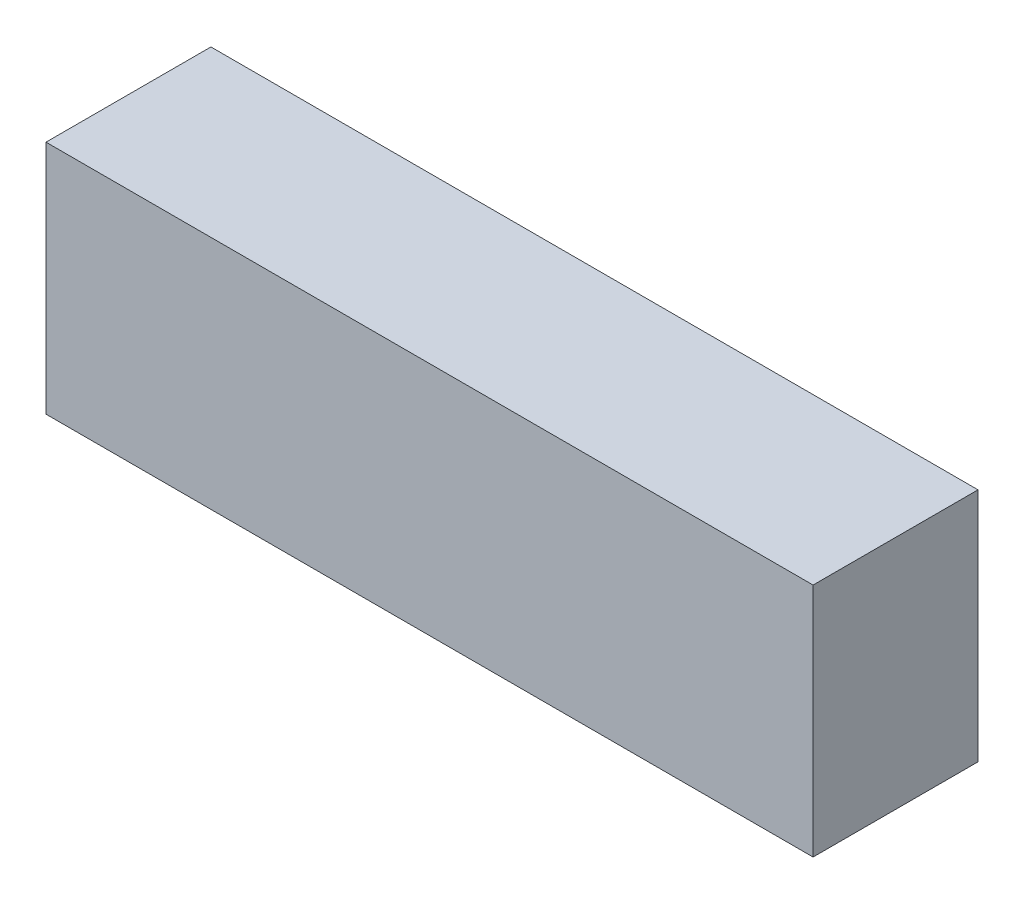
ISO-10303-21;
HEADER;
FILE_DESCRIPTION(('STEP AP214'),'2;1');
FILE_NAME('part.step','',(''),(''),'','','');
FILE_SCHEMA(('AUTOMOTIVE_DESIGN { 1 0 10303 214 1 1 1 1 }'));
ENDSEC;
DATA;
#1=APPLICATION_CONTEXT('core data for automotive mechanical design processes');
#2=APPLICATION_PROTOCOL_DEFINITION('international standard','automotive_design',2000,#1);
#3=PRODUCT_CONTEXT('',#1,'mechanical');
#4=PRODUCT('Part','Part','',(#3));
#5=PRODUCT_RELATED_PRODUCT_CATEGORY('part','',(#4));
#6=PRODUCT_DEFINITION_FORMATION('','',#4);
#7=PRODUCT_DEFINITION_CONTEXT('part definition',#1,'design');
#8=PRODUCT_DEFINITION('design','',#6,#7);
#9=PRODUCT_DEFINITION_SHAPE('','',#8);
#10=(LENGTH_UNIT() NAMED_UNIT(*) SI_UNIT(.MILLI.,.METRE.));
#11=(NAMED_UNIT(*) PLANE_ANGLE_UNIT() SI_UNIT($,.RADIAN.));
#12=(NAMED_UNIT(*) SI_UNIT($,.STERADIAN.) SOLID_ANGLE_UNIT());
#13=UNCERTAINTY_MEASURE_WITH_UNIT(LENGTH_MEASURE(1.E-05),#10,'distance_accuracy_value','');
#14=(GEOMETRIC_REPRESENTATION_CONTEXT(3) GLOBAL_UNCERTAINTY_ASSIGNED_CONTEXT((#13)) GLOBAL_UNIT_ASSIGNED_CONTEXT((#10,
#11,#12)) REPRESENTATION_CONTEXT('',''));
#15=CARTESIAN_POINT('',(0.,0.,0.));
#16=DIRECTION('',(0.,0.,1.));
#17=DIRECTION('',(1.,0.,0.));
#18=AXIS2_PLACEMENT_3D('',#15,#16,#17);
#19=CARTESIAN_POINT('',(16.2798731277834,5.,7.));
#20=DIRECTION('',(-1.,0.,0.));
#21=DIRECTION('',(0.,-1.,0.));
#22=AXIS2_PLACEMENT_3D('',#19,#20,#21);
#23=PLANE('',#22);
#24=DIRECTION('',(0.,1.,0.));
#25=VECTOR('',#24,1.);
#26=CARTESIAN_POINT('',(16.2798731277834,5.,0.));
#27=LINE('',#26,#25);
#28=CARTESIAN_POINT('',(16.2798731277834,-5.,0.));
#29=VERTEX_POINT('',#28);
#30=CARTESIAN_POINT('',(16.2798731277834,5.,0.));
#31=VERTEX_POINT('',#30);
#32=EDGE_CURVE('E94',#29,#31,#27,.T.);
#33=ORIENTED_EDGE('',*,*,#32,.T.);
#34=DIRECTION('',(0.,0.,-1.));
#35=VECTOR('',#34,1.);
#36=CARTESIAN_POINT('',(16.2798731277834,5.,7.));
#37=LINE('',#36,#35);
#38=CARTESIAN_POINT('',(16.2798731277834,5.,7.));
#39=VERTEX_POINT('',#38);
#40=EDGE_CURVE('E11',#39,#31,#37,.T.);
#41=ORIENTED_EDGE('',*,*,#40,.F.);
#42=DIRECTION('',(0.,1.,0.));
#43=VECTOR('',#42,1.);
#44=CARTESIAN_POINT('',(16.2798731277834,5.,7.));
#45=LINE('',#44,#43);
#46=CARTESIAN_POINT('',(16.2798731277834,-5.,7.));
#47=VERTEX_POINT('',#46);
#48=EDGE_CURVE('E82',#47,#39,#45,.T.);
#49=ORIENTED_EDGE('',*,*,#48,.F.);
#50=DIRECTION('',(0.,0.,-1.));
#51=VECTOR('',#50,1.);
#52=CARTESIAN_POINT('',(16.2798731277834,-5.,7.));
#53=LINE('',#52,#51);
#54=EDGE_CURVE('E90',#47,#29,#53,.T.);
#55=ORIENTED_EDGE('',*,*,#54,.T.);
#56=EDGE_LOOP('',(#33,#41,#49,#55));
#57=FACE_BOUND('',#56,.T.);
#58=ADVANCED_FACE('F31',(#57),#23,.F.);
#59=CARTESIAN_POINT('',(-16.2798731277834,5.,7.));
#60=DIRECTION('',(0.,-1.,0.));
#61=DIRECTION('',(0.,0.,-1.));
#62=AXIS2_PLACEMENT_3D('',#59,#60,#61);
#63=PLANE('',#62);
#64=DIRECTION('',(-1.,0.,0.));
#65=VECTOR('',#64,1.);
#66=CARTESIAN_POINT('',(-16.2798731277834,5.,0.));
#67=LINE('',#66,#65);
#68=CARTESIAN_POINT('',(-16.2798731277834,5.,0.));
#69=VERTEX_POINT('',#68);
#70=EDGE_CURVE('E86',#31,#69,#67,.T.);
#71=ORIENTED_EDGE('',*,*,#70,.T.);
#72=DIRECTION('',(0.,0.,-1.));
#73=VECTOR('',#72,1.);
#74=CARTESIAN_POINT('',(-16.2798731277834,5.,7.));
#75=LINE('',#74,#73);
#76=CARTESIAN_POINT('',(-16.2798731277834,5.,7.));
#77=VERTEX_POINT('',#76);
#78=EDGE_CURVE('E39',#77,#69,#75,.T.);
#79=ORIENTED_EDGE('',*,*,#78,.F.);
#80=DIRECTION('',(-1.,0.,0.));
#81=VECTOR('',#80,1.);
#82=CARTESIAN_POINT('',(-16.2798731277834,5.,7.));
#83=LINE('',#82,#81);
#84=EDGE_CURVE('E77',#39,#77,#83,.T.);
#85=ORIENTED_EDGE('',*,*,#84,.F.);
#86=ORIENTED_EDGE('',*,*,#40,.T.);
#87=EDGE_LOOP('',(#71,#79,#85,#86));
#88=FACE_BOUND('',#87,.T.);
#89=ADVANCED_FACE('F85',(#88),#63,.F.);
#90=CARTESIAN_POINT('',(-16.2798731277834,5.,7.));
#91=DIRECTION('',(1.,0.,0.));
#92=DIRECTION('',(0.,0.,-1.));
#93=AXIS2_PLACEMENT_3D('',#90,#91,#92);
#94=PLANE('',#93);
#95=DIRECTION('',(0.,-1.,0.));
#96=VECTOR('',#95,1.);
#97=CARTESIAN_POINT('',(-16.2798731277834,5.,0.));
#98=LINE('',#97,#96);
#99=CARTESIAN_POINT('',(-16.2798731277834,-5.,0.));
#100=VERTEX_POINT('',#99);
#101=EDGE_CURVE('E64',#69,#100,#98,.T.);
#102=ORIENTED_EDGE('',*,*,#101,.T.);
#103=DIRECTION('',(0.,0.,-1.));
#104=VECTOR('',#103,1.);
#105=CARTESIAN_POINT('',(-16.2798731277834,-5.,7.));
#106=LINE('',#105,#104);
#107=CARTESIAN_POINT('',(-16.2798731277834,-5.,7.));
#108=VERTEX_POINT('',#107);
#109=EDGE_CURVE('E87',#108,#100,#106,.T.);
#110=ORIENTED_EDGE('',*,*,#109,.F.);
#111=DIRECTION('',(0.,-1.,0.));
#112=VECTOR('',#111,1.);
#113=CARTESIAN_POINT('',(-16.2798731277834,5.,7.));
#114=LINE('',#113,#112);
#115=EDGE_CURVE('E80',#77,#108,#114,.T.);
#116=ORIENTED_EDGE('',*,*,#115,.F.);
#117=ORIENTED_EDGE('',*,*,#78,.T.);
#118=EDGE_LOOP('',(#102,#110,#116,#117));
#119=FACE_BOUND('',#118,.T.);
#120=ADVANCED_FACE('F88',(#119),#94,.F.);
#121=CARTESIAN_POINT('',(-16.2798731277834,-5.,7.));
#122=DIRECTION('',(0.,1.,0.));
#123=DIRECTION('',(0.,0.,1.));
#124=AXIS2_PLACEMENT_3D('',#121,#122,#123);
#125=PLANE('',#124);
#126=DIRECTION('',(1.,0.,0.));
#127=VECTOR('',#126,1.);
#128=CARTESIAN_POINT('',(-16.2798731277834,-5.,0.));
#129=LINE('',#128,#127);
#130=EDGE_CURVE('E70',#100,#29,#129,.T.);
#131=ORIENTED_EDGE('',*,*,#130,.T.);
#132=ORIENTED_EDGE('',*,*,#54,.F.);
#133=DIRECTION('',(1.,0.,0.));
#134=VECTOR('',#133,1.);
#135=CARTESIAN_POINT('',(-16.2798731277834,-5.,7.));
#136=LINE('',#135,#134);
#137=EDGE_CURVE('E47',#108,#47,#136,.T.);
#138=ORIENTED_EDGE('',*,*,#137,.F.);
#139=ORIENTED_EDGE('',*,*,#109,.T.);
#140=EDGE_LOOP('',(#131,#132,#138,#139));
#141=FACE_BOUND('',#140,.T.);
#142=ADVANCED_FACE('F101',(#141),#125,.F.);
#143=CARTESIAN_POINT('',(16.2798731277834,-5.,7.));
#144=DIRECTION('',(0.,0.,1.));
#145=DIRECTION('',(1.,0.,0.));
#146=AXIS2_PLACEMENT_3D('',#143,#144,#145);
#147=PLANE('',#146);
#148=ORIENTED_EDGE('',*,*,#48,.T.);
#149=ORIENTED_EDGE('',*,*,#84,.T.);
#150=ORIENTED_EDGE('',*,*,#115,.T.);
#151=ORIENTED_EDGE('',*,*,#137,.T.);
#152=EDGE_LOOP('',(#148,#149,#150,#151));
#153=FACE_BOUND('',#152,.T.);
#154=ADVANCED_FACE('F78',(#153),#147,.T.);
#155=CARTESIAN_POINT('',(16.2798731277834,-5.,0.));
#156=DIRECTION('',(0.,0.,1.));
#157=DIRECTION('',(1.,0.,0.));
#158=AXIS2_PLACEMENT_3D('',#155,#156,#157);
#159=PLANE('',#158);
#160=ORIENTED_EDGE('',*,*,#32,.F.);
#161=ORIENTED_EDGE('',*,*,#130,.F.);
#162=ORIENTED_EDGE('',*,*,#101,.F.);
#163=ORIENTED_EDGE('',*,*,#70,.F.);
#164=EDGE_LOOP('',(#160,#161,#162,#163));
#165=FACE_BOUND('',#164,.T.);
#166=ADVANCED_FACE('F104',(#165),#159,.F.);
#167=CLOSED_SHELL('',(#58,#89,#120,#142,#154,#166));
#168=MANIFOLD_SOLID_BREP('B2',#167);
#169=ADVANCED_BREP_SHAPE_REPRESENTATION('',(#18,#168),#14);
#170=SHAPE_DEFINITION_REPRESENTATION(#9,#169);
ENDSEC;
END-ISO-10303-21;
